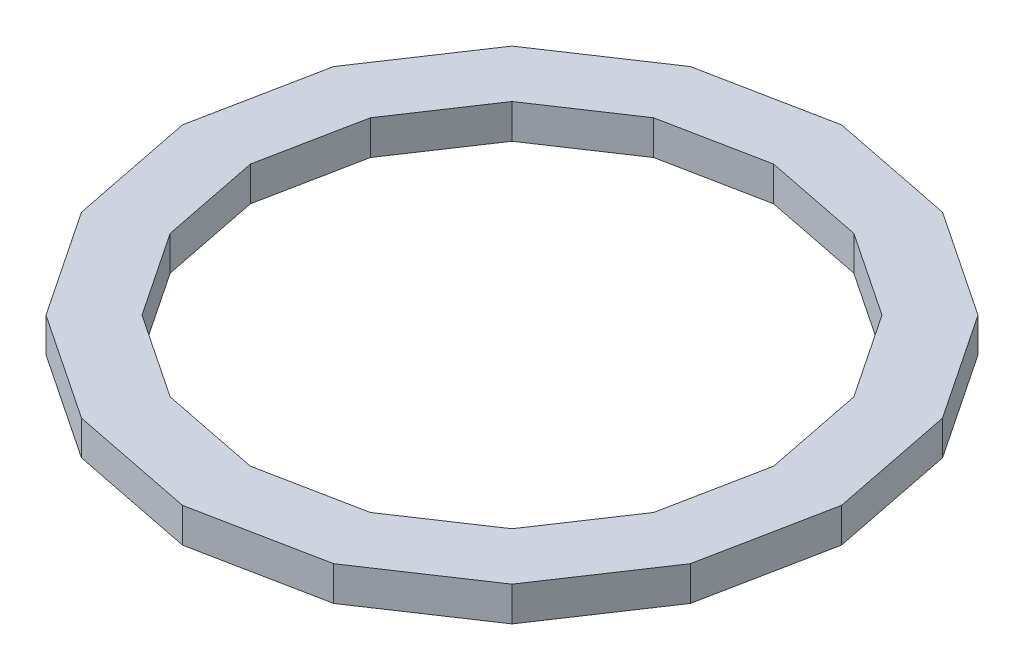
ISO-10303-21;
HEADER;
FILE_DESCRIPTION(('STEP AP214'),'2;1');
FILE_NAME('part.step','',(''),(''),'','','');
FILE_SCHEMA(('AUTOMOTIVE_DESIGN { 1 0 10303 214 1 1 1 1 }'));
ENDSEC;
DATA;
#1=APPLICATION_CONTEXT('core data for automotive mechanical design processes');
#2=APPLICATION_PROTOCOL_DEFINITION('international standard','automotive_design',2000,#1);
#3=PRODUCT_CONTEXT('',#1,'mechanical');
#4=PRODUCT('Part','Part','',(#3));
#5=PRODUCT_RELATED_PRODUCT_CATEGORY('part','',(#4));
#6=PRODUCT_DEFINITION_FORMATION('','',#4);
#7=PRODUCT_DEFINITION_CONTEXT('part definition',#1,'design');
#8=PRODUCT_DEFINITION('design','',#6,#7);
#9=PRODUCT_DEFINITION_SHAPE('','',#8);
#10=(LENGTH_UNIT() NAMED_UNIT(*) SI_UNIT(.MILLI.,.METRE.));
#11=(NAMED_UNIT(*) PLANE_ANGLE_UNIT() SI_UNIT($,.RADIAN.));
#12=(NAMED_UNIT(*) SI_UNIT($,.STERADIAN.) SOLID_ANGLE_UNIT());
#13=UNCERTAINTY_MEASURE_WITH_UNIT(LENGTH_MEASURE(1.E-05),#10,'distance_accuracy_value','');
#14=(GEOMETRIC_REPRESENTATION_CONTEXT(3) GLOBAL_UNCERTAINTY_ASSIGNED_CONTEXT((#13)) GLOBAL_UNIT_ASSIGNED_CONTEXT((#10,
#11,#12)) REPRESENTATION_CONTEXT('',''));
#15=CARTESIAN_POINT('',(0.,0.,0.));
#16=DIRECTION('',(0.,0.,1.));
#17=DIRECTION('',(1.,0.,0.));
#18=AXIS2_PLACEMENT_3D('',#15,#16,#17);
#19=CARTESIAN_POINT('',(0.,19.05,0.));
#20=DIRECTION('',(0.,1.,0.));
#21=DIRECTION('',(0.,0.,1.));
#22=AXIS2_PLACEMENT_3D('',#19,#20,#21);
#23=PLANE('',#22);
#24=DIRECTION('',(0.195090322016117,0.,-0.980785280403233));
#25=VECTOR('',#24,1.);
#26=CARTESIAN_POINT('',(168.399722941589,19.05,69.7534491422757));
#27=LINE('',#26,#25);
#28=CARTESIAN_POINT('',(168.399722941589,19.05,69.7534491422757));
#29=VERTEX_POINT('',#28);
#30=CARTESIAN_POINT('',(182.274546643376,19.05,-2.01228314618185E-12));
#31=VERTEX_POINT('',#30);
#32=EDGE_CURVE('E379',#29,#31,#27,.T.);
#33=ORIENTED_EDGE('',*,*,#32,.T.);
#34=DIRECTION('',(-0.195090322016139,0.,-0.980785280403228));
#35=VECTOR('',#34,1.);
#36=CARTESIAN_POINT('',(182.274546643376,19.05,-2.01228314618185E-12));
#37=LINE('',#36,#35);
#38=CARTESIAN_POINT('',(168.399722941588,19.05,-69.7534491422796));
#39=VERTEX_POINT('',#38);
#40=EDGE_CURVE('E383',#31,#39,#37,.T.);
#41=ORIENTED_EDGE('',*,*,#40,.T.);
#42=DIRECTION('',(-0.555570233019612,0.,-0.831469612302539));
#43=VECTOR('',#42,1.);
#44=CARTESIAN_POINT('',(168.399722941588,19.05,-69.7534491422796));
#45=LINE('',#44,#43);
#46=CARTESIAN_POINT('',(128.887567969233,19.05,-128.887567969236));
#47=VERTEX_POINT('',#46);
#48=EDGE_CURVE('E387',#39,#47,#45,.T.);
#49=ORIENTED_EDGE('',*,*,#48,.T.);
#50=DIRECTION('',(-0.831469612302552,0.,-0.555570233019593));
#51=VECTOR('',#50,1.);
#52=CARTESIAN_POINT('',(128.887567969233,19.05,-128.887567969236));
#53=LINE('',#52,#51);
#54=CARTESIAN_POINT('',(69.7534491422757,19.05,-168.399722941589));
#55=VERTEX_POINT('',#54);
#56=EDGE_CURVE('E389',#47,#55,#53,.T.);
#57=ORIENTED_EDGE('',*,*,#56,.T.);
#58=DIRECTION('',(-0.980785280403233,0.,-0.195090322016117));
#59=VECTOR('',#58,1.);
#60=CARTESIAN_POINT('',(69.7534491422757,19.05,-168.399722941589));
#61=LINE('',#60,#59);
#62=CARTESIAN_POINT('',(-2.12402351105558E-12,19.05,-182.274546643376));
#63=VERTEX_POINT('',#62);
#64=EDGE_CURVE('E392',#55,#63,#61,.T.);
#65=ORIENTED_EDGE('',*,*,#64,.T.);
#66=DIRECTION('',(-0.980785280403228,0.,0.19509032201614));
#67=VECTOR('',#66,1.);
#68=CARTESIAN_POINT('',(-2.12402351105558E-12,19.05,-182.274546643376));
#69=LINE('',#68,#67);
#70=CARTESIAN_POINT('',(-69.7534491422796,19.05,-168.399722941588));
#71=VERTEX_POINT('',#70);
#72=EDGE_CURVE('E394',#63,#71,#69,.T.);
#73=ORIENTED_EDGE('',*,*,#72,.T.);
#74=DIRECTION('',(-0.831469612302539,0.,0.555570233019612));
#75=VECTOR('',#74,1.);
#76=CARTESIAN_POINT('',(-69.7534491422796,19.05,-168.399722941588));
#77=LINE('',#76,#75);
#78=CARTESIAN_POINT('',(-128.887567969236,19.05,-128.887567969233));
#79=VERTEX_POINT('',#78);
#80=EDGE_CURVE('E397',#71,#79,#77,.T.);
#81=ORIENTED_EDGE('',*,*,#80,.T.);
#82=DIRECTION('',(-0.555570233019592,0.,0.831469612302552));
#83=VECTOR('',#82,1.);
#84=CARTESIAN_POINT('',(-128.887567969236,19.05,-128.887567969233));
#85=LINE('',#84,#83);
#86=CARTESIAN_POINT('',(-168.399722941589,19.05,-69.7534491422757));
#87=VERTEX_POINT('',#86);
#88=EDGE_CURVE('E400',#79,#87,#85,.T.);
#89=ORIENTED_EDGE('',*,*,#88,.T.);
#90=DIRECTION('',(-0.195090322016117,0.,0.980785280403233));
#91=VECTOR('',#90,1.);
#92=CARTESIAN_POINT('',(-168.399722941589,19.05,-69.7534491422757));
#93=LINE('',#92,#91);
#94=CARTESIAN_POINT('',(-182.274546643376,19.05,2.02633280482964E-12));
#95=VERTEX_POINT('',#94);
#96=EDGE_CURVE('E403',#87,#95,#93,.T.);
#97=ORIENTED_EDGE('',*,*,#96,.T.);
#98=DIRECTION('',(0.195090322016139,0.,0.980785280403228));
#99=VECTOR('',#98,1.);
#100=CARTESIAN_POINT('',(-182.274546643376,19.05,2.02633280482964E-12));
#101=LINE('',#100,#99);
#102=CARTESIAN_POINT('',(-168.399722941588,19.05,69.7534491422796));
#103=VERTEX_POINT('',#102);
#104=EDGE_CURVE('E406',#95,#103,#101,.T.);
#105=ORIENTED_EDGE('',*,*,#104,.T.);
#106=DIRECTION('',(0.555570233019612,0.,0.831469612302539));
#107=VECTOR('',#106,1.);
#108=CARTESIAN_POINT('',(-168.399722941588,19.05,69.7534491422796));
#109=LINE('',#108,#107);
#110=CARTESIAN_POINT('',(-128.887567969233,19.05,128.887567969236));
#111=VERTEX_POINT('',#110);
#112=EDGE_CURVE('E408',#103,#111,#109,.T.);
#113=ORIENTED_EDGE('',*,*,#112,.T.);
#114=DIRECTION('',(0.831469612302552,0.,0.555570233019593));
#115=VECTOR('',#114,1.);
#116=CARTESIAN_POINT('',(-128.887567969233,19.05,128.887567969236));
#117=LINE('',#116,#115);
#118=CARTESIAN_POINT('',(-69.7534491422758,19.05,168.399722941589));
#119=VERTEX_POINT('',#118);
#120=EDGE_CURVE('E410',#111,#119,#117,.T.);
#121=ORIENTED_EDGE('',*,*,#120,.T.);
#122=DIRECTION('',(0.980785280403233,0.,0.195090322016118));
#123=VECTOR('',#122,1.);
#124=CARTESIAN_POINT('',(-69.7534491422758,19.05,168.399722941589));
#125=LINE('',#124,#123);
#126=CARTESIAN_POINT('',(2.11134736883345E-12,19.05,182.274546643376));
#127=VERTEX_POINT('',#126);
#128=EDGE_CURVE('E412',#119,#127,#125,.T.);
#129=ORIENTED_EDGE('',*,*,#128,.T.);
#130=DIRECTION('',(0.980785280403228,0.,-0.195090322016139));
#131=VECTOR('',#130,1.);
#132=CARTESIAN_POINT('',(2.11134736883345E-12,19.05,182.274546643376));
#133=LINE('',#132,#131);
#134=CARTESIAN_POINT('',(69.7534491422796,19.05,168.399722941588));
#135=VERTEX_POINT('',#134);
#136=EDGE_CURVE('E414',#127,#135,#133,.T.);
#137=ORIENTED_EDGE('',*,*,#136,.T.);
#138=DIRECTION('',(0.831469612302539,0.,-0.555570233019612));
#139=VECTOR('',#138,1.);
#140=CARTESIAN_POINT('',(69.7534491422796,19.05,168.399722941588));
#141=LINE('',#140,#139);
#142=CARTESIAN_POINT('',(128.887567969236,19.05,128.887567969233));
#143=VERTEX_POINT('',#142);
#144=EDGE_CURVE('E416',#135,#143,#141,.T.);
#145=ORIENTED_EDGE('',*,*,#144,.T.);
#146=DIRECTION('',(0.555570233019593,0.,-0.831469612302551));
#147=VECTOR('',#146,1.);
#148=CARTESIAN_POINT('',(128.887567969236,19.05,128.887567969233));
#149=LINE('',#148,#147);
#150=EDGE_CURVE('E419',#143,#29,#149,.T.);
#151=ORIENTED_EDGE('',*,*,#150,.T.);
#152=EDGE_LOOP('',(#33,#41,#49,#57,#65,#73,#81,#89,#97,#105,#113,#121,#129,#137,#145,#151));
#153=FACE_BOUND('',#152,.T.);
#154=DIRECTION('',(-0.195090322016139,0.,-0.980785280403228));
#155=VECTOR('',#154,1.);
#156=CARTESIAN_POINT('',(144.723004286563,19.05,-1.56151390142899E-12));
#157=LINE('',#156,#155);
#158=CARTESIAN_POINT('',(144.723004286563,19.05,-1.56151390142899E-12));
#159=VERTEX_POINT('',#158);
#160=CARTESIAN_POINT('',(133.706621543898,19.05,-55.3830960225711));
#161=VERTEX_POINT('',#160);
#162=EDGE_CURVE('E252',#159,#161,#157,.T.);
#163=ORIENTED_EDGE('',*,*,#162,.F.);
#164=DIRECTION('',(0.195090322016117,0.,-0.980785280403233));
#165=VECTOR('',#164,1.);
#166=CARTESIAN_POINT('',(133.7066215439,19.05,55.3830960225681));
#167=LINE('',#166,#165);
#168=CARTESIAN_POINT('',(133.7066215439,19.05,55.3830960225681));
#169=VERTEX_POINT('',#168);
#170=EDGE_CURVE('E243',#169,#159,#167,.T.);
#171=ORIENTED_EDGE('',*,*,#170,.F.);
#172=DIRECTION('',(0.555570233019593,0.,-0.831469612302552));
#173=VECTOR('',#172,1.);
#174=CARTESIAN_POINT('',(102.33461772472,19.05,102.334617724718));
#175=LINE('',#174,#173);
#176=CARTESIAN_POINT('',(102.33461772472,19.05,102.334617724718));
#177=VERTEX_POINT('',#176);
#178=EDGE_CURVE('E301',#177,#169,#175,.T.);
#179=ORIENTED_EDGE('',*,*,#178,.F.);
#180=DIRECTION('',(0.831469612302539,0.,-0.555570233019612));
#181=VECTOR('',#180,1.);
#182=CARTESIAN_POINT('',(55.3830960225712,19.05,133.706621543898));
#183=LINE('',#182,#181);
#184=CARTESIAN_POINT('',(55.3830960225712,19.05,133.706621543898));
#185=VERTEX_POINT('',#184);
#186=EDGE_CURVE('E299',#185,#177,#183,.T.);
#187=ORIENTED_EDGE('',*,*,#186,.F.);
#188=DIRECTION('',(0.980785280403228,0.,-0.195090322016139));
#189=VECTOR('',#188,1.);
#190=CARTESIAN_POINT('',(1.69946050796369E-12,19.05,144.723004286563));
#191=LINE('',#190,#189);
#192=CARTESIAN_POINT('',(1.69946050796369E-12,19.05,144.723004286563));
#193=VERTEX_POINT('',#192);
#194=EDGE_CURVE('E297',#193,#185,#191,.T.);
#195=ORIENTED_EDGE('',*,*,#194,.F.);
#196=DIRECTION('',(0.980785280403233,0.,0.195090322016117));
#197=VECTOR('',#196,1.);
#198=CARTESIAN_POINT('',(-55.3830960225681,19.05,133.7066215439));
#199=LINE('',#198,#197);
#200=CARTESIAN_POINT('',(-55.3830960225681,19.05,133.7066215439));
#201=VERTEX_POINT('',#200);
#202=EDGE_CURVE('E295',#201,#193,#199,.T.);
#203=ORIENTED_EDGE('',*,*,#202,.F.);
#204=DIRECTION('',(0.831469612302552,0.,0.555570233019593));
#205=VECTOR('',#204,1.);
#206=CARTESIAN_POINT('',(-102.334617724717,19.05,102.33461772472));
#207=LINE('',#206,#205);
#208=CARTESIAN_POINT('',(-102.334617724717,19.05,102.33461772472));
#209=VERTEX_POINT('',#208);
#210=EDGE_CURVE('E293',#209,#201,#207,.T.);
#211=ORIENTED_EDGE('',*,*,#210,.F.);
#212=DIRECTION('',(0.555570233019612,0.,0.831469612302539));
#213=VECTOR('',#212,1.);
#214=CARTESIAN_POINT('',(-133.706621543898,19.05,55.3830960225711));
#215=LINE('',#214,#213);
#216=CARTESIAN_POINT('',(-133.706621543898,19.05,55.3830960225711));
#217=VERTEX_POINT('',#216);
#218=EDGE_CURVE('E291',#217,#209,#215,.T.);
#219=ORIENTED_EDGE('',*,*,#218,.F.);
#220=DIRECTION('',(0.19509032201614,0.,0.980785280403228));
#221=VECTOR('',#220,1.);
#222=CARTESIAN_POINT('',(-144.723004286563,19.05,1.6581214529041E-12));
#223=LINE('',#222,#221);
#224=CARTESIAN_POINT('',(-144.723004286563,19.05,1.6581214529041E-12));
#225=VERTEX_POINT('',#224);
#226=EDGE_CURVE('E289',#225,#217,#223,.T.);
#227=ORIENTED_EDGE('',*,*,#226,.F.);
#228=DIRECTION('',(-0.195090322016117,0.,0.980785280403233));
#229=VECTOR('',#228,1.);
#230=CARTESIAN_POINT('',(-133.7066215439,19.05,-55.383096022568));
#231=LINE('',#230,#229);
#232=CARTESIAN_POINT('',(-133.7066215439,19.05,-55.383096022568));
#233=VERTEX_POINT('',#232);
#234=EDGE_CURVE('E287',#233,#225,#231,.T.);
#235=ORIENTED_EDGE('',*,*,#234,.F.);
#236=DIRECTION('',(-0.555570233019593,0.,0.831469612302552));
#237=VECTOR('',#236,1.);
#238=CARTESIAN_POINT('',(-102.33461772472,19.05,-102.334617724717));
#239=LINE('',#238,#237);
#240=CARTESIAN_POINT('',(-102.33461772472,19.05,-102.334617724717));
#241=VERTEX_POINT('',#240);
#242=EDGE_CURVE('E284',#241,#233,#239,.T.);
#243=ORIENTED_EDGE('',*,*,#242,.F.);
#244=DIRECTION('',(-0.831469612302539,0.,0.555570233019612));
#245=VECTOR('',#244,1.);
#246=CARTESIAN_POINT('',(-55.3830960225711,19.05,-133.706621543898));
#247=LINE('',#246,#245);
#248=CARTESIAN_POINT('',(-55.3830960225711,19.05,-133.706621543898));
#249=VERTEX_POINT('',#248);
#250=EDGE_CURVE('E281',#249,#241,#247,.T.);
#251=ORIENTED_EDGE('',*,*,#250,.F.);
#252=DIRECTION('',(-0.980785280403228,0.,0.195090322016139));
#253=VECTOR('',#252,1.);
#254=CARTESIAN_POINT('',(-1.68620863738242E-12,19.05,-144.723004286563));
#255=LINE('',#254,#253);
#256=CARTESIAN_POINT('',(-1.68620863738242E-12,19.05,-144.723004286563));
#257=VERTEX_POINT('',#256);
#258=EDGE_CURVE('E279',#257,#249,#255,.T.);
#259=ORIENTED_EDGE('',*,*,#258,.F.);
#260=DIRECTION('',(-0.980785280403233,0.,-0.195090322016117));
#261=VECTOR('',#260,1.);
#262=CARTESIAN_POINT('',(55.3830960225681,19.05,-133.7066215439));
#263=LINE('',#262,#261);
#264=CARTESIAN_POINT('',(55.3830960225681,19.05,-133.7066215439));
#265=VERTEX_POINT('',#264);
#266=EDGE_CURVE('E276',#265,#257,#263,.T.);
#267=ORIENTED_EDGE('',*,*,#266,.F.);
#268=DIRECTION('',(-0.831469612302552,0.,-0.555570233019593));
#269=VECTOR('',#268,1.);
#270=CARTESIAN_POINT('',(102.334617724717,19.05,-102.33461772472));
#271=LINE('',#270,#269);
#272=CARTESIAN_POINT('',(102.334617724717,19.05,-102.33461772472));
#273=VERTEX_POINT('',#272);
#274=EDGE_CURVE('E272',#273,#265,#271,.T.);
#275=ORIENTED_EDGE('',*,*,#274,.F.);
#276=DIRECTION('',(-0.555570233019612,0.,-0.831469612302539));
#277=VECTOR('',#276,1.);
#278=CARTESIAN_POINT('',(133.706621543898,19.05,-55.3830960225711));
#279=LINE('',#278,#277);
#280=EDGE_CURVE('E265',#161,#273,#279,.T.);
#281=ORIENTED_EDGE('',*,*,#280,.F.);
#282=EDGE_LOOP('',(#163,#171,#179,#187,#195,#203,#211,#219,#227,#235,#243,#251,#259,#267,#275,#281));
#283=FACE_BOUND('',#282,.T.);
#284=ADVANCED_FACE('F34',(#153,#283),#23,.T.);
#285=CARTESIAN_POINT('',(0.,0.,0.));
#286=DIRECTION('',(0.,1.,0.));
#287=DIRECTION('',(0.,0.,1.));
#288=AXIS2_PLACEMENT_3D('',#285,#286,#287);
#289=PLANE('',#288);
#290=DIRECTION('',(0.195090322016117,0.,-0.980785280403233));
#291=VECTOR('',#290,1.);
#292=CARTESIAN_POINT('',(168.399722941589,0.,69.7534491422757));
#293=LINE('',#292,#291);
#294=CARTESIAN_POINT('',(168.399722941589,0.,69.7534491422757));
#295=VERTEX_POINT('',#294);
#296=CARTESIAN_POINT('',(182.274546643376,0.,-2.01228314618185E-12));
#297=VERTEX_POINT('',#296);
#298=EDGE_CURVE('E260',#295,#297,#293,.T.);
#299=ORIENTED_EDGE('',*,*,#298,.F.);
#300=DIRECTION('',(0.555570233019593,0.,-0.831469612302551));
#301=VECTOR('',#300,1.);
#302=CARTESIAN_POINT('',(128.887567969236,0.,128.887567969233));
#303=LINE('',#302,#301);
#304=CARTESIAN_POINT('',(128.887567969236,0.,128.887567969233));
#305=VERTEX_POINT('',#304);
#306=EDGE_CURVE('E384',#305,#295,#303,.T.);
#307=ORIENTED_EDGE('',*,*,#306,.F.);
#308=DIRECTION('',(0.831469612302539,0.,-0.555570233019612));
#309=VECTOR('',#308,1.);
#310=CARTESIAN_POINT('',(69.7534491422796,0.,168.399722941588));
#311=LINE('',#310,#309);
#312=CARTESIAN_POINT('',(69.7534491422796,0.,168.399722941588));
#313=VERTEX_POINT('',#312);
#314=EDGE_CURVE('E453',#313,#305,#311,.T.);
#315=ORIENTED_EDGE('',*,*,#314,.F.);
#316=DIRECTION('',(0.980785280403228,0.,-0.195090322016139));
#317=VECTOR('',#316,1.);
#318=CARTESIAN_POINT('',(2.11134736883345E-12,0.,182.274546643376));
#319=LINE('',#318,#317);
#320=CARTESIAN_POINT('',(2.11134736883345E-12,0.,182.274546643376));
#321=VERTEX_POINT('',#320);
#322=EDGE_CURVE('E451',#321,#313,#319,.T.);
#323=ORIENTED_EDGE('',*,*,#322,.F.);
#324=DIRECTION('',(0.980785280403233,0.,0.195090322016118));
#325=VECTOR('',#324,1.);
#326=CARTESIAN_POINT('',(-69.7534491422758,0.,168.399722941589));
#327=LINE('',#326,#325);
#328=CARTESIAN_POINT('',(-69.7534491422758,0.,168.399722941589));
#329=VERTEX_POINT('',#328);
#330=EDGE_CURVE('E449',#329,#321,#327,.T.);
#331=ORIENTED_EDGE('',*,*,#330,.F.);
#332=DIRECTION('',(0.831469612302552,0.,0.555570233019593));
#333=VECTOR('',#332,1.);
#334=CARTESIAN_POINT('',(-128.887567969233,0.,128.887567969236));
#335=LINE('',#334,#333);
#336=CARTESIAN_POINT('',(-128.887567969233,0.,128.887567969236));
#337=VERTEX_POINT('',#336);
#338=EDGE_CURVE('E447',#337,#329,#335,.T.);
#339=ORIENTED_EDGE('',*,*,#338,.F.);
#340=DIRECTION('',(0.555570233019612,0.,0.831469612302539));
#341=VECTOR('',#340,1.);
#342=CARTESIAN_POINT('',(-168.399722941588,0.,69.7534491422796));
#343=LINE('',#342,#341);
#344=CARTESIAN_POINT('',(-168.399722941588,0.,69.7534491422796));
#345=VERTEX_POINT('',#344);
#346=EDGE_CURVE('E444',#345,#337,#343,.T.);
#347=ORIENTED_EDGE('',*,*,#346,.F.);
#348=DIRECTION('',(0.195090322016139,0.,0.980785280403228));
#349=VECTOR('',#348,1.);
#350=CARTESIAN_POINT('',(-182.274546643376,0.,2.02633280482964E-12));
#351=LINE('',#350,#349);
#352=CARTESIAN_POINT('',(-182.274546643376,0.,2.02633280482964E-12));
#353=VERTEX_POINT('',#352);
#354=EDGE_CURVE('E442',#353,#345,#351,.T.);
#355=ORIENTED_EDGE('',*,*,#354,.F.);
#356=DIRECTION('',(-0.195090322016117,0.,0.980785280403233));
#357=VECTOR('',#356,1.);
#358=CARTESIAN_POINT('',(-168.399722941589,0.,-69.7534491422757));
#359=LINE('',#358,#357);
#360=CARTESIAN_POINT('',(-168.399722941589,0.,-69.7534491422757));
#361=VERTEX_POINT('',#360);
#362=EDGE_CURVE('E440',#361,#353,#359,.T.);
#363=ORIENTED_EDGE('',*,*,#362,.F.);
#364=DIRECTION('',(-0.555570233019592,0.,0.831469612302552));
#365=VECTOR('',#364,1.);
#366=CARTESIAN_POINT('',(-128.887567969236,0.,-128.887567969233));
#367=LINE('',#366,#365);
#368=CARTESIAN_POINT('',(-128.887567969236,0.,-128.887567969233));
#369=VERTEX_POINT('',#368);
#370=EDGE_CURVE('E437',#369,#361,#367,.T.);
#371=ORIENTED_EDGE('',*,*,#370,.F.);
#372=DIRECTION('',(-0.831469612302539,0.,0.555570233019612));
#373=VECTOR('',#372,1.);
#374=CARTESIAN_POINT('',(-69.7534491422796,0.,-168.399722941588));
#375=LINE('',#374,#373);
#376=CARTESIAN_POINT('',(-69.7534491422796,0.,-168.399722941588));
#377=VERTEX_POINT('',#376);
#378=EDGE_CURVE('E435',#377,#369,#375,.T.);
#379=ORIENTED_EDGE('',*,*,#378,.F.);
#380=DIRECTION('',(-0.980785280403228,0.,0.19509032201614));
#381=VECTOR('',#380,1.);
#382=CARTESIAN_POINT('',(-2.12402351105558E-12,0.,-182.274546643376));
#383=LINE('',#382,#381);
#384=CARTESIAN_POINT('',(-2.12402351105558E-12,0.,-182.274546643376));
#385=VERTEX_POINT('',#384);
#386=EDGE_CURVE('E433',#385,#377,#383,.T.);
#387=ORIENTED_EDGE('',*,*,#386,.F.);
#388=DIRECTION('',(-0.980785280403233,0.,-0.195090322016117));
#389=VECTOR('',#388,1.);
#390=CARTESIAN_POINT('',(69.7534491422757,0.,-168.399722941589));
#391=LINE('',#390,#389);
#392=CARTESIAN_POINT('',(69.7534491422757,0.,-168.399722941589));
#393=VERTEX_POINT('',#392);
#394=EDGE_CURVE('E431',#393,#385,#391,.T.);
#395=ORIENTED_EDGE('',*,*,#394,.F.);
#396=DIRECTION('',(-0.831469612302552,0.,-0.555570233019593));
#397=VECTOR('',#396,1.);
#398=CARTESIAN_POINT('',(128.887567969233,0.,-128.887567969236));
#399=LINE('',#398,#397);
#400=CARTESIAN_POINT('',(128.887567969233,0.,-128.887567969236));
#401=VERTEX_POINT('',#400);
#402=EDGE_CURVE('E429',#401,#393,#399,.T.);
#403=ORIENTED_EDGE('',*,*,#402,.F.);
#404=DIRECTION('',(-0.555570233019612,0.,-0.831469612302539));
#405=VECTOR('',#404,1.);
#406=CARTESIAN_POINT('',(168.399722941588,0.,-69.7534491422796));
#407=LINE('',#406,#405);
#408=CARTESIAN_POINT('',(168.399722941588,0.,-69.7534491422796));
#409=VERTEX_POINT('',#408);
#410=EDGE_CURVE('E426',#409,#401,#407,.T.);
#411=ORIENTED_EDGE('',*,*,#410,.F.);
#412=DIRECTION('',(-0.195090322016139,0.,-0.980785280403228));
#413=VECTOR('',#412,1.);
#414=CARTESIAN_POINT('',(182.274546643376,0.,-2.01228314618185E-12));
#415=LINE('',#414,#413);
#416=EDGE_CURVE('E424',#297,#409,#415,.T.);
#417=ORIENTED_EDGE('',*,*,#416,.F.);
#418=EDGE_LOOP('',(#299,#307,#315,#323,#331,#339,#347,#355,#363,#371,#379,#387,#395,#403,#411,#417));
#419=FACE_BOUND('',#418,.T.);
#420=DIRECTION('',(0.195090322016117,0.,-0.980785280403233));
#421=VECTOR('',#420,1.);
#422=CARTESIAN_POINT('',(133.7066215439,0.,55.3830960225681));
#423=LINE('',#422,#421);
#424=CARTESIAN_POINT('',(133.7066215439,0.,55.3830960225681));
#425=VERTEX_POINT('',#424);
#426=CARTESIAN_POINT('',(144.723004286563,0.,-1.56151390142899E-12));
#427=VERTEX_POINT('',#426);
#428=EDGE_CURVE('E57',#425,#427,#423,.T.);
#429=ORIENTED_EDGE('',*,*,#428,.T.);
#430=DIRECTION('',(-0.195090322016139,0.,-0.980785280403228));
#431=VECTOR('',#430,1.);
#432=CARTESIAN_POINT('',(144.723004286563,0.,-1.56151390142899E-12));
#433=LINE('',#432,#431);
#434=CARTESIAN_POINT('',(133.706621543898,0.,-55.3830960225711));
#435=VERTEX_POINT('',#434);
#436=EDGE_CURVE('E259',#427,#435,#433,.T.);
#437=ORIENTED_EDGE('',*,*,#436,.T.);
#438=DIRECTION('',(-0.555570233019612,0.,-0.831469612302539));
#439=VECTOR('',#438,1.);
#440=CARTESIAN_POINT('',(133.706621543898,0.,-55.3830960225711));
#441=LINE('',#440,#439);
#442=CARTESIAN_POINT('',(102.334617724717,0.,-102.33461772472));
#443=VERTEX_POINT('',#442);
#444=EDGE_CURVE('E307',#435,#443,#441,.T.);
#445=ORIENTED_EDGE('',*,*,#444,.T.);
#446=DIRECTION('',(-0.831469612302552,0.,-0.555570233019593));
#447=VECTOR('',#446,1.);
#448=CARTESIAN_POINT('',(102.334617724717,0.,-102.33461772472));
#449=LINE('',#448,#447);
#450=CARTESIAN_POINT('',(55.3830960225681,0.,-133.7066215439));
#451=VERTEX_POINT('',#450);
#452=EDGE_CURVE('E311',#443,#451,#449,.T.);
#453=ORIENTED_EDGE('',*,*,#452,.T.);
#454=DIRECTION('',(-0.980785280403233,0.,-0.195090322016117));
#455=VECTOR('',#454,1.);
#456=CARTESIAN_POINT('',(55.3830960225681,0.,-133.7066215439));
#457=LINE('',#456,#455);
#458=CARTESIAN_POINT('',(-1.68620863738242E-12,0.,-144.723004286563));
#459=VERTEX_POINT('',#458);
#460=EDGE_CURVE('E314',#451,#459,#457,.T.);
#461=ORIENTED_EDGE('',*,*,#460,.T.);
#462=DIRECTION('',(-0.980785280403228,0.,0.195090322016139));
#463=VECTOR('',#462,1.);
#464=CARTESIAN_POINT('',(-1.68620863738242E-12,0.,-144.723004286563));
#465=LINE('',#464,#463);
#466=CARTESIAN_POINT('',(-55.3830960225711,0.,-133.706621543898));
#467=VERTEX_POINT('',#466);
#468=EDGE_CURVE('E317',#459,#467,#465,.T.);
#469=ORIENTED_EDGE('',*,*,#468,.T.);
#470=DIRECTION('',(-0.831469612302539,0.,0.555570233019612));
#471=VECTOR('',#470,1.);
#472=CARTESIAN_POINT('',(-55.3830960225711,0.,-133.706621543898));
#473=LINE('',#472,#471);
#474=CARTESIAN_POINT('',(-102.33461772472,0.,-102.334617724717));
#475=VERTEX_POINT('',#474);
#476=EDGE_CURVE('E320',#467,#475,#473,.T.);
#477=ORIENTED_EDGE('',*,*,#476,.T.);
#478=DIRECTION('',(-0.555570233019593,0.,0.831469612302552));
#479=VECTOR('',#478,1.);
#480=CARTESIAN_POINT('',(-102.33461772472,0.,-102.334617724717));
#481=LINE('',#480,#479);
#482=CARTESIAN_POINT('',(-133.7066215439,0.,-55.383096022568));
#483=VERTEX_POINT('',#482);
#484=EDGE_CURVE('E323',#475,#483,#481,.T.);
#485=ORIENTED_EDGE('',*,*,#484,.T.);
#486=DIRECTION('',(-0.195090322016117,0.,0.980785280403233));
#487=VECTOR('',#486,1.);
#488=CARTESIAN_POINT('',(-133.7066215439,0.,-55.383096022568));
#489=LINE('',#488,#487);
#490=CARTESIAN_POINT('',(-144.723004286563,0.,1.6581214529041E-12));
#491=VERTEX_POINT('',#490);
#492=EDGE_CURVE('E327',#483,#491,#489,.T.);
#493=ORIENTED_EDGE('',*,*,#492,.T.);
#494=DIRECTION('',(0.19509032201614,0.,0.980785280403228));
#495=VECTOR('',#494,1.);
#496=CARTESIAN_POINT('',(-144.723004286563,0.,1.6581214529041E-12));
#497=LINE('',#496,#495);
#498=CARTESIAN_POINT('',(-133.706621543898,0.,55.3830960225711));
#499=VERTEX_POINT('',#498);
#500=EDGE_CURVE('E330',#491,#499,#497,.T.);
#501=ORIENTED_EDGE('',*,*,#500,.T.);
#502=DIRECTION('',(0.555570233019612,0.,0.831469612302539));
#503=VECTOR('',#502,1.);
#504=CARTESIAN_POINT('',(-133.706621543898,0.,55.3830960225711));
#505=LINE('',#504,#503);
#506=CARTESIAN_POINT('',(-102.334617724717,0.,102.33461772472));
#507=VERTEX_POINT('',#506);
#508=EDGE_CURVE('E333',#499,#507,#505,.T.);
#509=ORIENTED_EDGE('',*,*,#508,.T.);
#510=DIRECTION('',(0.831469612302552,0.,0.555570233019593));
#511=VECTOR('',#510,1.);
#512=CARTESIAN_POINT('',(-102.334617724717,0.,102.33461772472));
#513=LINE('',#512,#511);
#514=CARTESIAN_POINT('',(-55.3830960225681,0.,133.7066215439));
#515=VERTEX_POINT('',#514);
#516=EDGE_CURVE('E336',#507,#515,#513,.T.);
#517=ORIENTED_EDGE('',*,*,#516,.T.);
#518=DIRECTION('',(0.980785280403233,0.,0.195090322016117));
#519=VECTOR('',#518,1.);
#520=CARTESIAN_POINT('',(-55.3830960225681,0.,133.7066215439));
#521=LINE('',#520,#519);
#522=CARTESIAN_POINT('',(1.69946050796369E-12,0.,144.723004286563));
#523=VERTEX_POINT('',#522);
#524=EDGE_CURVE('E339',#515,#523,#521,.T.);
#525=ORIENTED_EDGE('',*,*,#524,.T.);
#526=DIRECTION('',(0.980785280403228,0.,-0.195090322016139));
#527=VECTOR('',#526,1.);
#528=CARTESIAN_POINT('',(1.69946050796369E-12,0.,144.723004286563));
#529=LINE('',#528,#527);
#530=CARTESIAN_POINT('',(55.3830960225712,0.,133.706621543898));
#531=VERTEX_POINT('',#530);
#532=EDGE_CURVE('E342',#523,#531,#529,.T.);
#533=ORIENTED_EDGE('',*,*,#532,.T.);
#534=DIRECTION('',(0.831469612302539,0.,-0.555570233019612));
#535=VECTOR('',#534,1.);
#536=CARTESIAN_POINT('',(55.3830960225712,0.,133.706621543898));
#537=LINE('',#536,#535);
#538=CARTESIAN_POINT('',(102.33461772472,0.,102.334617724718));
#539=VERTEX_POINT('',#538);
#540=EDGE_CURVE('E345',#531,#539,#537,.T.);
#541=ORIENTED_EDGE('',*,*,#540,.T.);
#542=DIRECTION('',(0.555570233019593,0.,-0.831469612302552));
#543=VECTOR('',#542,1.);
#544=CARTESIAN_POINT('',(102.33461772472,0.,102.334617724718));
#545=LINE('',#544,#543);
#546=EDGE_CURVE('E253',#539,#425,#545,.T.);
#547=ORIENTED_EDGE('',*,*,#546,.T.);
#548=EDGE_LOOP('',(#429,#437,#445,#453,#461,#469,#477,#485,#493,#501,#509,#517,#525,#533,#541,#547));
#549=FACE_BOUND('',#548,.T.);
#550=ADVANCED_FACE('F511',(#419,#549),#289,.F.);
#551=CARTESIAN_POINT('',(168.399722941589,19.05,69.7534491422757));
#552=DIRECTION('',(-0.980785280403233,0.,-0.195090322016117));
#553=DIRECTION('',(-0.195090322016117,0.,0.980785280403233));
#554=AXIS2_PLACEMENT_3D('',#551,#552,#553);
#555=PLANE('',#554);
#556=ORIENTED_EDGE('',*,*,#298,.T.);
#557=DIRECTION('',(0.,-1.,0.));
#558=VECTOR('',#557,1.);
#559=CARTESIAN_POINT('',(182.274546643376,19.05,-2.01228314618185E-12));
#560=LINE('',#559,#558);
#561=EDGE_CURVE('E11',#31,#297,#560,.T.);
#562=ORIENTED_EDGE('',*,*,#561,.F.);
#563=ORIENTED_EDGE('',*,*,#32,.F.);
#564=DIRECTION('',(0.,-1.,0.));
#565=VECTOR('',#564,1.);
#566=CARTESIAN_POINT('',(168.399722941589,19.05,69.7534491422757));
#567=LINE('',#566,#565);
#568=EDGE_CURVE('E421',#29,#295,#567,.T.);
#569=ORIENTED_EDGE('',*,*,#568,.T.);
#570=EDGE_LOOP('',(#556,#562,#563,#569));
#571=FACE_BOUND('',#570,.T.);
#572=ADVANCED_FACE('F36',(#571),#555,.F.);
#573=CARTESIAN_POINT('',(182.274546643376,19.05,-2.01228314618185E-12));
#574=DIRECTION('',(-0.980785280403228,0.,0.195090322016139));
#575=DIRECTION('',(0.195090322016139,0.,0.980785280403228));
#576=AXIS2_PLACEMENT_3D('',#573,#574,#575);
#577=PLANE('',#576);
#578=ORIENTED_EDGE('',*,*,#416,.T.);
#579=DIRECTION('',(0.,-1.,0.));
#580=VECTOR('',#579,1.);
#581=CARTESIAN_POINT('',(168.399722941588,19.05,-69.7534491422796));
#582=LINE('',#581,#580);
#583=EDGE_CURVE('E42',#39,#409,#582,.T.);
#584=ORIENTED_EDGE('',*,*,#583,.F.);
#585=ORIENTED_EDGE('',*,*,#40,.F.);
#586=ORIENTED_EDGE('',*,*,#561,.T.);
#587=EDGE_LOOP('',(#578,#584,#585,#586));
#588=FACE_BOUND('',#587,.T.);
#589=ADVANCED_FACE('F528',(#588),#577,.F.);
#590=CARTESIAN_POINT('',(168.399722941588,19.05,-69.7534491422796));
#591=DIRECTION('',(-0.831469612302539,0.,0.555570233019612));
#592=DIRECTION('',(0.555570233019612,0.,0.831469612302539));
#593=AXIS2_PLACEMENT_3D('',#590,#591,#592);
#594=PLANE('',#593);
#595=ORIENTED_EDGE('',*,*,#410,.T.);
#596=DIRECTION('',(0.,-1.,0.));
#597=VECTOR('',#596,1.);
#598=CARTESIAN_POINT('',(128.887567969233,19.05,-128.887567969236));
#599=LINE('',#598,#597);
#600=EDGE_CURVE('E498',#47,#401,#599,.T.);
#601=ORIENTED_EDGE('',*,*,#600,.F.);
#602=ORIENTED_EDGE('',*,*,#48,.F.);
#603=ORIENTED_EDGE('',*,*,#583,.T.);
#604=EDGE_LOOP('',(#595,#601,#602,#603));
#605=FACE_BOUND('',#604,.T.);
#606=ADVANCED_FACE('F505',(#605),#594,.F.);
#607=CARTESIAN_POINT('',(128.887567969233,19.05,-128.887567969236));
#608=DIRECTION('',(-0.555570233019592,0.,0.831469612302552));
#609=DIRECTION('',(0.831469612302552,0.,0.555570233019593));
#610=AXIS2_PLACEMENT_3D('',#607,#608,#609);
#611=PLANE('',#610);
#612=ORIENTED_EDGE('',*,*,#402,.T.);
#613=DIRECTION('',(0.,-1.,0.));
#614=VECTOR('',#613,1.);
#615=CARTESIAN_POINT('',(69.7534491422757,19.05,-168.399722941589));
#616=LINE('',#615,#614);
#617=EDGE_CURVE('E495',#55,#393,#616,.T.);
#618=ORIENTED_EDGE('',*,*,#617,.F.);
#619=ORIENTED_EDGE('',*,*,#56,.F.);
#620=ORIENTED_EDGE('',*,*,#600,.T.);
#621=EDGE_LOOP('',(#612,#618,#619,#620));
#622=FACE_BOUND('',#621,.T.);
#623=ADVANCED_FACE('F517',(#622),#611,.F.);
#624=CARTESIAN_POINT('',(69.7534491422757,19.05,-168.399722941589));
#625=DIRECTION('',(-0.195090322016117,0.,0.980785280403233));
#626=DIRECTION('',(0.980785280403233,0.,0.195090322016117));
#627=AXIS2_PLACEMENT_3D('',#624,#625,#626);
#628=PLANE('',#627);
#629=ORIENTED_EDGE('',*,*,#394,.T.);
#630=DIRECTION('',(0.,-1.,0.));
#631=VECTOR('',#630,1.);
#632=CARTESIAN_POINT('',(-2.12402351105558E-12,19.05,-182.274546643376));
#633=LINE('',#632,#631);
#634=EDGE_CURVE('E491',#63,#385,#633,.T.);
#635=ORIENTED_EDGE('',*,*,#634,.F.);
#636=ORIENTED_EDGE('',*,*,#64,.F.);
#637=ORIENTED_EDGE('',*,*,#617,.T.);
#638=EDGE_LOOP('',(#629,#635,#636,#637));
#639=FACE_BOUND('',#638,.T.);
#640=ADVANCED_FACE('F521',(#639),#628,.F.);
#641=CARTESIAN_POINT('',(-2.12402351105558E-12,19.05,-182.274546643376));
#642=DIRECTION('',(0.19509032201614,0.,0.980785280403228));
#643=DIRECTION('',(0.980785280403228,0.,-0.19509032201614));
#644=AXIS2_PLACEMENT_3D('',#641,#642,#643);
#645=PLANE('',#644);
#646=ORIENTED_EDGE('',*,*,#386,.T.);
#647=DIRECTION('',(0.,-1.,0.));
#648=VECTOR('',#647,1.);
#649=CARTESIAN_POINT('',(-69.7534491422796,19.05,-168.399722941588));
#650=LINE('',#649,#648);
#651=EDGE_CURVE('E487',#71,#377,#650,.T.);
#652=ORIENTED_EDGE('',*,*,#651,.F.);
#653=ORIENTED_EDGE('',*,*,#72,.F.);
#654=ORIENTED_EDGE('',*,*,#634,.T.);
#655=EDGE_LOOP('',(#646,#652,#653,#654));
#656=FACE_BOUND('',#655,.T.);
#657=ADVANCED_FACE('F581',(#656),#645,.F.);
#658=CARTESIAN_POINT('',(-69.7534491422796,19.05,-168.399722941588));
#659=DIRECTION('',(0.555570233019612,0.,0.831469612302539));
#660=DIRECTION('',(0.831469612302539,0.,-0.555570233019612));
#661=AXIS2_PLACEMENT_3D('',#658,#659,#660);
#662=PLANE('',#661);
#663=ORIENTED_EDGE('',*,*,#378,.T.);
#664=DIRECTION('',(0.,-1.,0.));
#665=VECTOR('',#664,1.);
#666=CARTESIAN_POINT('',(-128.887567969236,19.05,-128.887567969233));
#667=LINE('',#666,#665);
#668=EDGE_CURVE('E484',#79,#369,#667,.T.);
#669=ORIENTED_EDGE('',*,*,#668,.F.);
#670=ORIENTED_EDGE('',*,*,#80,.F.);
#671=ORIENTED_EDGE('',*,*,#651,.T.);
#672=EDGE_LOOP('',(#663,#669,#670,#671));
#673=FACE_BOUND('',#672,.T.);
#674=ADVANCED_FACE('F578',(#673),#662,.F.);
#675=CARTESIAN_POINT('',(-128.887567969236,19.05,-128.887567969233));
#676=DIRECTION('',(0.831469612302552,0.,0.555570233019592));
#677=DIRECTION('',(0.555570233019592,0.,-0.831469612302552));
#678=AXIS2_PLACEMENT_3D('',#675,#676,#677);
#679=PLANE('',#678);
#680=ORIENTED_EDGE('',*,*,#370,.T.);
#681=DIRECTION('',(0.,-1.,0.));
#682=VECTOR('',#681,1.);
#683=CARTESIAN_POINT('',(-168.399722941589,19.05,-69.7534491422757));
#684=LINE('',#683,#682);
#685=EDGE_CURVE('E480',#87,#361,#684,.T.);
#686=ORIENTED_EDGE('',*,*,#685,.F.);
#687=ORIENTED_EDGE('',*,*,#88,.F.);
#688=ORIENTED_EDGE('',*,*,#668,.T.);
#689=EDGE_LOOP('',(#680,#686,#687,#688));
#690=FACE_BOUND('',#689,.T.);
#691=ADVANCED_FACE('F574',(#690),#679,.F.);
#692=CARTESIAN_POINT('',(-168.399722941589,19.05,-69.7534491422757));
#693=DIRECTION('',(0.980785280403233,0.,0.195090322016117));
#694=DIRECTION('',(0.195090322016117,0.,-0.980785280403233));
#695=AXIS2_PLACEMENT_3D('',#692,#693,#694);
#696=PLANE('',#695);
#697=ORIENTED_EDGE('',*,*,#362,.T.);
#698=DIRECTION('',(0.,-1.,0.));
#699=VECTOR('',#698,1.);
#700=CARTESIAN_POINT('',(-182.274546643376,19.05,2.02633280482964E-12));
#701=LINE('',#700,#699);
#702=EDGE_CURVE('E477',#95,#353,#701,.T.);
#703=ORIENTED_EDGE('',*,*,#702,.F.);
#704=ORIENTED_EDGE('',*,*,#96,.F.);
#705=ORIENTED_EDGE('',*,*,#685,.T.);
#706=EDGE_LOOP('',(#697,#703,#704,#705));
#707=FACE_BOUND('',#706,.T.);
#708=ADVANCED_FACE('F570',(#707),#696,.F.);
#709=CARTESIAN_POINT('',(-182.274546643376,19.05,2.02633280482964E-12));
#710=DIRECTION('',(0.980785280403228,0.,-0.195090322016139));
#711=DIRECTION('',(-0.195090322016139,0.,-0.980785280403228));
#712=AXIS2_PLACEMENT_3D('',#709,#710,#711);
#713=PLANE('',#712);
#714=ORIENTED_EDGE('',*,*,#354,.T.);
#715=DIRECTION('',(0.,-1.,0.));
#716=VECTOR('',#715,1.);
#717=CARTESIAN_POINT('',(-168.399722941588,19.05,69.7534491422796));
#718=LINE('',#717,#716);
#719=EDGE_CURVE('E474',#103,#345,#718,.T.);
#720=ORIENTED_EDGE('',*,*,#719,.F.);
#721=ORIENTED_EDGE('',*,*,#104,.F.);
#722=ORIENTED_EDGE('',*,*,#702,.T.);
#723=EDGE_LOOP('',(#714,#720,#721,#722));
#724=FACE_BOUND('',#723,.T.);
#725=ADVANCED_FACE('F565',(#724),#713,.F.);
#726=CARTESIAN_POINT('',(-168.399722941588,19.05,69.7534491422796));
#727=DIRECTION('',(0.831469612302539,0.,-0.555570233019612));
#728=DIRECTION('',(-0.555570233019612,0.,-0.831469612302539));
#729=AXIS2_PLACEMENT_3D('',#726,#727,#728);
#730=PLANE('',#729);
#731=ORIENTED_EDGE('',*,*,#346,.T.);
#732=DIRECTION('',(0.,-1.,0.));
#733=VECTOR('',#732,1.);
#734=CARTESIAN_POINT('',(-128.887567969233,19.05,128.887567969236));
#735=LINE('',#734,#733);
#736=EDGE_CURVE('E471',#111,#337,#735,.T.);
#737=ORIENTED_EDGE('',*,*,#736,.F.);
#738=ORIENTED_EDGE('',*,*,#112,.F.);
#739=ORIENTED_EDGE('',*,*,#719,.T.);
#740=EDGE_LOOP('',(#731,#737,#738,#739));
#741=FACE_BOUND('',#740,.T.);
#742=ADVANCED_FACE('F559',(#741),#730,.F.);
#743=CARTESIAN_POINT('',(-128.887567969233,19.05,128.887567969236));
#744=DIRECTION('',(0.555570233019593,0.,-0.831469612302552));
#745=DIRECTION('',(-0.831469612302552,0.,-0.555570233019593));
#746=AXIS2_PLACEMENT_3D('',#743,#744,#745);
#747=PLANE('',#746);
#748=ORIENTED_EDGE('',*,*,#338,.T.);
#749=DIRECTION('',(0.,-1.,0.));
#750=VECTOR('',#749,1.);
#751=CARTESIAN_POINT('',(-69.7534491422758,19.05,168.399722941589));
#752=LINE('',#751,#750);
#753=EDGE_CURVE('E468',#119,#329,#752,.T.);
#754=ORIENTED_EDGE('',*,*,#753,.F.);
#755=ORIENTED_EDGE('',*,*,#120,.F.);
#756=ORIENTED_EDGE('',*,*,#736,.T.);
#757=EDGE_LOOP('',(#748,#754,#755,#756));
#758=FACE_BOUND('',#757,.T.);
#759=ADVANCED_FACE('F555',(#758),#747,.F.);
#760=CARTESIAN_POINT('',(-69.7534491422758,19.05,168.399722941589));
#761=DIRECTION('',(0.195090322016118,0.,-0.980785280403233));
#762=DIRECTION('',(-0.980785280403233,0.,-0.195090322016118));
#763=AXIS2_PLACEMENT_3D('',#760,#761,#762);
#764=PLANE('',#763);
#765=ORIENTED_EDGE('',*,*,#330,.T.);
#766=DIRECTION('',(0.,-1.,0.));
#767=VECTOR('',#766,1.);
#768=CARTESIAN_POINT('',(2.11134736883345E-12,19.05,182.274546643376));
#769=LINE('',#768,#767);
#770=EDGE_CURVE('E465',#127,#321,#769,.T.);
#771=ORIENTED_EDGE('',*,*,#770,.F.);
#772=ORIENTED_EDGE('',*,*,#128,.F.);
#773=ORIENTED_EDGE('',*,*,#753,.T.);
#774=EDGE_LOOP('',(#765,#771,#772,#773));
#775=FACE_BOUND('',#774,.T.);
#776=ADVANCED_FACE('F550',(#775),#764,.F.);
#777=CARTESIAN_POINT('',(2.11134736883345E-12,19.05,182.274546643376));
#778=DIRECTION('',(-0.195090322016139,0.,-0.980785280403228));
#779=DIRECTION('',(-0.980785280403228,0.,0.195090322016139));
#780=AXIS2_PLACEMENT_3D('',#777,#778,#779);
#781=PLANE('',#780);
#782=ORIENTED_EDGE('',*,*,#322,.T.);
#783=DIRECTION('',(0.,-1.,0.));
#784=VECTOR('',#783,1.);
#785=CARTESIAN_POINT('',(69.7534491422796,19.05,168.399722941588));
#786=LINE('',#785,#784);
#787=EDGE_CURVE('E462',#135,#313,#786,.T.);
#788=ORIENTED_EDGE('',*,*,#787,.F.);
#789=ORIENTED_EDGE('',*,*,#136,.F.);
#790=ORIENTED_EDGE('',*,*,#770,.T.);
#791=EDGE_LOOP('',(#782,#788,#789,#790));
#792=FACE_BOUND('',#791,.T.);
#793=ADVANCED_FACE('F544',(#792),#781,.F.);
#794=CARTESIAN_POINT('',(69.7534491422796,19.05,168.399722941588));
#795=DIRECTION('',(-0.555570233019612,0.,-0.831469612302539));
#796=DIRECTION('',(-0.831469612302539,0.,0.555570233019612));
#797=AXIS2_PLACEMENT_3D('',#794,#795,#796);
#798=PLANE('',#797);
#799=ORIENTED_EDGE('',*,*,#314,.T.);
#800=DIRECTION('',(0.,-1.,0.));
#801=VECTOR('',#800,1.);
#802=CARTESIAN_POINT('',(128.887567969236,19.05,128.887567969233));
#803=LINE('',#802,#801);
#804=EDGE_CURVE('E459',#143,#305,#803,.T.);
#805=ORIENTED_EDGE('',*,*,#804,.F.);
#806=ORIENTED_EDGE('',*,*,#144,.F.);
#807=ORIENTED_EDGE('',*,*,#787,.T.);
#808=EDGE_LOOP('',(#799,#805,#806,#807));
#809=FACE_BOUND('',#808,.T.);
#810=ADVANCED_FACE('F540',(#809),#798,.F.);
#811=CARTESIAN_POINT('',(128.887567969236,19.05,128.887567969233));
#812=DIRECTION('',(-0.831469612302551,0.,-0.555570233019593));
#813=DIRECTION('',(-0.555570233019593,0.,0.831469612302551));
#814=AXIS2_PLACEMENT_3D('',#811,#812,#813);
#815=PLANE('',#814);
#816=ORIENTED_EDGE('',*,*,#306,.T.);
#817=ORIENTED_EDGE('',*,*,#568,.F.);
#818=ORIENTED_EDGE('',*,*,#150,.F.);
#819=ORIENTED_EDGE('',*,*,#804,.T.);
#820=EDGE_LOOP('',(#816,#817,#818,#819));
#821=FACE_BOUND('',#820,.T.);
#822=ADVANCED_FACE('F535',(#821),#815,.F.);
#823=CARTESIAN_POINT('',(133.7066215439,19.05,55.3830960225681));
#824=DIRECTION('',(-0.980785280403233,0.,-0.195090322016117));
#825=DIRECTION('',(-0.195090322016117,0.,0.980785280403233));
#826=AXIS2_PLACEMENT_3D('',#823,#824,#825);
#827=PLANE('',#826);
#828=ORIENTED_EDGE('',*,*,#428,.F.);
#829=DIRECTION('',(0.,-1.,0.));
#830=VECTOR('',#829,1.);
#831=CARTESIAN_POINT('',(133.7066215439,19.05,55.3830960225681));
#832=LINE('',#831,#830);
#833=EDGE_CURVE('E247',#169,#425,#832,.T.);
#834=ORIENTED_EDGE('',*,*,#833,.F.);
#835=ORIENTED_EDGE('',*,*,#170,.T.);
#836=DIRECTION('',(0.,-1.,0.));
#837=VECTOR('',#836,1.);
#838=CARTESIAN_POINT('',(144.723004286563,19.05,-1.56151390142899E-12));
#839=LINE('',#838,#837);
#840=EDGE_CURVE('E246',#159,#427,#839,.T.);
#841=ORIENTED_EDGE('',*,*,#840,.T.);
#842=EDGE_LOOP('',(#828,#834,#835,#841));
#843=FACE_BOUND('',#842,.T.);
#844=ADVANCED_FACE('F245',(#843),#827,.T.);
#845=CARTESIAN_POINT('',(144.723004286563,19.05,-1.56151390142899E-12));
#846=DIRECTION('',(-0.980785280403228,0.,0.195090322016139));
#847=DIRECTION('',(0.195090322016139,0.,0.980785280403228));
#848=AXIS2_PLACEMENT_3D('',#845,#846,#847);
#849=PLANE('',#848);
#850=ORIENTED_EDGE('',*,*,#436,.F.);
#851=ORIENTED_EDGE('',*,*,#840,.F.);
#852=ORIENTED_EDGE('',*,*,#162,.T.);
#853=DIRECTION('',(0.,-1.,0.));
#854=VECTOR('',#853,1.);
#855=CARTESIAN_POINT('',(133.706621543898,19.05,-55.3830960225711));
#856=LINE('',#855,#854);
#857=EDGE_CURVE('E261',#161,#435,#856,.T.);
#858=ORIENTED_EDGE('',*,*,#857,.T.);
#859=EDGE_LOOP('',(#850,#851,#852,#858));
#860=FACE_BOUND('',#859,.T.);
#861=ADVANCED_FACE('F256',(#860),#849,.T.);
#862=CARTESIAN_POINT('',(133.706621543898,19.05,-55.3830960225711));
#863=DIRECTION('',(-0.831469612302539,0.,0.555570233019612));
#864=DIRECTION('',(0.555570233019612,0.,0.831469612302539));
#865=AXIS2_PLACEMENT_3D('',#862,#863,#864);
#866=PLANE('',#865);
#867=ORIENTED_EDGE('',*,*,#444,.F.);
#868=ORIENTED_EDGE('',*,*,#857,.F.);
#869=ORIENTED_EDGE('',*,*,#280,.T.);
#870=DIRECTION('',(0.,-1.,0.));
#871=VECTOR('',#870,1.);
#872=CARTESIAN_POINT('',(102.334617724717,19.05,-102.33461772472));
#873=LINE('',#872,#871);
#874=EDGE_CURVE('E374',#273,#443,#873,.T.);
#875=ORIENTED_EDGE('',*,*,#874,.T.);
#876=EDGE_LOOP('',(#867,#868,#869,#875));
#877=FACE_BOUND('',#876,.T.);
#878=ADVANCED_FACE('F663',(#877),#866,.T.);
#879=CARTESIAN_POINT('',(102.334617724717,19.05,-102.33461772472));
#880=DIRECTION('',(-0.555570233019592,0.,0.831469612302552));
#881=DIRECTION('',(0.831469612302552,0.,0.555570233019593));
#882=AXIS2_PLACEMENT_3D('',#879,#880,#881);
#883=PLANE('',#882);
#884=ORIENTED_EDGE('',*,*,#452,.F.);
#885=ORIENTED_EDGE('',*,*,#874,.F.);
#886=ORIENTED_EDGE('',*,*,#274,.T.);
#887=DIRECTION('',(0.,-1.,0.));
#888=VECTOR('',#887,1.);
#889=CARTESIAN_POINT('',(55.3830960225681,19.05,-133.7066215439));
#890=LINE('',#889,#888);
#891=EDGE_CURVE('E372',#265,#451,#890,.T.);
#892=ORIENTED_EDGE('',*,*,#891,.T.);
#893=EDGE_LOOP('',(#884,#885,#886,#892));
#894=FACE_BOUND('',#893,.T.);
#895=ADVANCED_FACE('F669',(#894),#883,.T.);
#896=CARTESIAN_POINT('',(55.3830960225681,19.05,-133.7066215439));
#897=DIRECTION('',(-0.195090322016117,0.,0.980785280403233));
#898=DIRECTION('',(0.980785280403233,0.,0.195090322016117));
#899=AXIS2_PLACEMENT_3D('',#896,#897,#898);
#900=PLANE('',#899);
#901=ORIENTED_EDGE('',*,*,#460,.F.);
#902=ORIENTED_EDGE('',*,*,#891,.F.);
#903=ORIENTED_EDGE('',*,*,#266,.T.);
#904=DIRECTION('',(0.,-1.,0.));
#905=VECTOR('',#904,1.);
#906=CARTESIAN_POINT('',(-1.68620863738242E-12,19.05,-144.723004286563));
#907=LINE('',#906,#905);
#908=EDGE_CURVE('E370',#257,#459,#907,.T.);
#909=ORIENTED_EDGE('',*,*,#908,.T.);
#910=EDGE_LOOP('',(#901,#902,#903,#909));
#911=FACE_BOUND('',#910,.T.);
#912=ADVANCED_FACE('F677',(#911),#900,.T.);
#913=CARTESIAN_POINT('',(-1.68620863738242E-12,19.05,-144.723004286563));
#914=DIRECTION('',(0.195090322016139,0.,0.980785280403228));
#915=DIRECTION('',(0.980785280403228,0.,-0.195090322016139));
#916=AXIS2_PLACEMENT_3D('',#913,#914,#915);
#917=PLANE('',#916);
#918=ORIENTED_EDGE('',*,*,#468,.F.);
#919=ORIENTED_EDGE('',*,*,#908,.F.);
#920=ORIENTED_EDGE('',*,*,#258,.T.);
#921=DIRECTION('',(0.,-1.,0.));
#922=VECTOR('',#921,1.);
#923=CARTESIAN_POINT('',(-55.3830960225711,19.05,-133.706621543898));
#924=LINE('',#923,#922);
#925=EDGE_CURVE('E368',#249,#467,#924,.T.);
#926=ORIENTED_EDGE('',*,*,#925,.T.);
#927=EDGE_LOOP('',(#918,#919,#920,#926));
#928=FACE_BOUND('',#927,.T.);
#929=ADVANCED_FACE('F685',(#928),#917,.T.);
#930=CARTESIAN_POINT('',(-55.3830960225711,19.05,-133.706621543898));
#931=DIRECTION('',(0.555570233019612,0.,0.831469612302539));
#932=DIRECTION('',(0.831469612302539,0.,-0.555570233019612));
#933=AXIS2_PLACEMENT_3D('',#930,#931,#932);
#934=PLANE('',#933);
#935=ORIENTED_EDGE('',*,*,#476,.F.);
#936=ORIENTED_EDGE('',*,*,#925,.F.);
#937=ORIENTED_EDGE('',*,*,#250,.T.);
#938=DIRECTION('',(0.,-1.,0.));
#939=VECTOR('',#938,1.);
#940=CARTESIAN_POINT('',(-102.33461772472,19.05,-102.334617724717));
#941=LINE('',#940,#939);
#942=EDGE_CURVE('E366',#241,#475,#941,.T.);
#943=ORIENTED_EDGE('',*,*,#942,.T.);
#944=EDGE_LOOP('',(#935,#936,#937,#943));
#945=FACE_BOUND('',#944,.T.);
#946=ADVANCED_FACE('F693',(#945),#934,.T.);
#947=CARTESIAN_POINT('',(-102.33461772472,19.05,-102.334617724717));
#948=DIRECTION('',(0.831469612302551,0.,0.555570233019593));
#949=DIRECTION('',(0.555570233019593,0.,-0.831469612302552));
#950=AXIS2_PLACEMENT_3D('',#947,#948,#949);
#951=PLANE('',#950);
#952=ORIENTED_EDGE('',*,*,#484,.F.);
#953=ORIENTED_EDGE('',*,*,#942,.F.);
#954=ORIENTED_EDGE('',*,*,#242,.T.);
#955=DIRECTION('',(0.,-1.,0.));
#956=VECTOR('',#955,1.);
#957=CARTESIAN_POINT('',(-133.7066215439,19.05,-55.383096022568));
#958=LINE('',#957,#956);
#959=EDGE_CURVE('E364',#233,#483,#958,.T.);
#960=ORIENTED_EDGE('',*,*,#959,.T.);
#961=EDGE_LOOP('',(#952,#953,#954,#960));
#962=FACE_BOUND('',#961,.T.);
#963=ADVANCED_FACE('F701',(#962),#951,.T.);
#964=CARTESIAN_POINT('',(-133.7066215439,19.05,-55.383096022568));
#965=DIRECTION('',(0.980785280403233,0.,0.195090322016117));
#966=DIRECTION('',(0.195090322016117,0.,-0.980785280403233));
#967=AXIS2_PLACEMENT_3D('',#964,#965,#966);
#968=PLANE('',#967);
#969=ORIENTED_EDGE('',*,*,#492,.F.);
#970=ORIENTED_EDGE('',*,*,#959,.F.);
#971=ORIENTED_EDGE('',*,*,#234,.T.);
#972=DIRECTION('',(0.,-1.,0.));
#973=VECTOR('',#972,1.);
#974=CARTESIAN_POINT('',(-144.723004286563,19.05,1.6581214529041E-12));
#975=LINE('',#974,#973);
#976=EDGE_CURVE('E362',#225,#491,#975,.T.);
#977=ORIENTED_EDGE('',*,*,#976,.T.);
#978=EDGE_LOOP('',(#969,#970,#971,#977));
#979=FACE_BOUND('',#978,.T.);
#980=ADVANCED_FACE('F709',(#979),#968,.T.);
#981=CARTESIAN_POINT('',(-144.723004286563,19.05,1.6581214529041E-12));
#982=DIRECTION('',(0.980785280403228,0.,-0.19509032201614));
#983=DIRECTION('',(-0.19509032201614,0.,-0.980785280403228));
#984=AXIS2_PLACEMENT_3D('',#981,#982,#983);
#985=PLANE('',#984);
#986=ORIENTED_EDGE('',*,*,#500,.F.);
#987=ORIENTED_EDGE('',*,*,#976,.F.);
#988=ORIENTED_EDGE('',*,*,#226,.T.);
#989=DIRECTION('',(0.,-1.,0.));
#990=VECTOR('',#989,1.);
#991=CARTESIAN_POINT('',(-133.706621543898,19.05,55.3830960225711));
#992=LINE('',#991,#990);
#993=EDGE_CURVE('E360',#217,#499,#992,.T.);
#994=ORIENTED_EDGE('',*,*,#993,.T.);
#995=EDGE_LOOP('',(#986,#987,#988,#994));
#996=FACE_BOUND('',#995,.T.);
#997=ADVANCED_FACE('F717',(#996),#985,.T.);
#998=CARTESIAN_POINT('',(-133.706621543898,19.05,55.3830960225711));
#999=DIRECTION('',(0.831469612302539,0.,-0.555570233019612));
#1000=DIRECTION('',(-0.555570233019612,0.,-0.831469612302539));
#1001=AXIS2_PLACEMENT_3D('',#998,#999,#1000);
#1002=PLANE('',#1001);
#1003=ORIENTED_EDGE('',*,*,#508,.F.);
#1004=ORIENTED_EDGE('',*,*,#993,.F.);
#1005=ORIENTED_EDGE('',*,*,#218,.T.);
#1006=DIRECTION('',(0.,-1.,0.));
#1007=VECTOR('',#1006,1.);
#1008=CARTESIAN_POINT('',(-102.334617724717,19.05,102.33461772472));
#1009=LINE('',#1008,#1007);
#1010=EDGE_CURVE('E358',#209,#507,#1009,.T.);
#1011=ORIENTED_EDGE('',*,*,#1010,.T.);
#1012=EDGE_LOOP('',(#1003,#1004,#1005,#1011));
#1013=FACE_BOUND('',#1012,.T.);
#1014=ADVANCED_FACE('F725',(#1013),#1002,.T.);
#1015=CARTESIAN_POINT('',(-102.334617724717,19.05,102.33461772472));
#1016=DIRECTION('',(0.555570233019593,0.,-0.831469612302552));
#1017=DIRECTION('',(-0.831469612302552,0.,-0.555570233019593));
#1018=AXIS2_PLACEMENT_3D('',#1015,#1016,#1017);
#1019=PLANE('',#1018);
#1020=ORIENTED_EDGE('',*,*,#516,.F.);
#1021=ORIENTED_EDGE('',*,*,#1010,.F.);
#1022=ORIENTED_EDGE('',*,*,#210,.T.);
#1023=DIRECTION('',(0.,-1.,0.));
#1024=VECTOR('',#1023,1.);
#1025=CARTESIAN_POINT('',(-55.3830960225681,19.05,133.7066215439));
#1026=LINE('',#1025,#1024);
#1027=EDGE_CURVE('E356',#201,#515,#1026,.T.);
#1028=ORIENTED_EDGE('',*,*,#1027,.T.);
#1029=EDGE_LOOP('',(#1020,#1021,#1022,#1028));
#1030=FACE_BOUND('',#1029,.T.);
#1031=ADVANCED_FACE('F733',(#1030),#1019,.T.);
#1032=CARTESIAN_POINT('',(-55.3830960225681,19.05,133.7066215439));
#1033=DIRECTION('',(0.195090322016117,0.,-0.980785280403233));
#1034=DIRECTION('',(-0.980785280403233,0.,-0.195090322016117));
#1035=AXIS2_PLACEMENT_3D('',#1032,#1033,#1034);
#1036=PLANE('',#1035);
#1037=ORIENTED_EDGE('',*,*,#524,.F.);
#1038=ORIENTED_EDGE('',*,*,#1027,.F.);
#1039=ORIENTED_EDGE('',*,*,#202,.T.);
#1040=DIRECTION('',(0.,-1.,0.));
#1041=VECTOR('',#1040,1.);
#1042=CARTESIAN_POINT('',(1.69946050796369E-12,19.05,144.723004286563));
#1043=LINE('',#1042,#1041);
#1044=EDGE_CURVE('E354',#193,#523,#1043,.T.);
#1045=ORIENTED_EDGE('',*,*,#1044,.T.);
#1046=EDGE_LOOP('',(#1037,#1038,#1039,#1045));
#1047=FACE_BOUND('',#1046,.T.);
#1048=ADVANCED_FACE('F741',(#1047),#1036,.T.);
#1049=CARTESIAN_POINT('',(1.69946050796369E-12,19.05,144.723004286563));
#1050=DIRECTION('',(-0.195090322016139,0.,-0.980785280403228));
#1051=DIRECTION('',(-0.980785280403228,0.,0.195090322016139));
#1052=AXIS2_PLACEMENT_3D('',#1049,#1050,#1051);
#1053=PLANE('',#1052);
#1054=ORIENTED_EDGE('',*,*,#532,.F.);
#1055=ORIENTED_EDGE('',*,*,#1044,.F.);
#1056=ORIENTED_EDGE('',*,*,#194,.T.);
#1057=DIRECTION('',(0.,-1.,0.));
#1058=VECTOR('',#1057,1.);
#1059=CARTESIAN_POINT('',(55.3830960225712,19.05,133.706621543898));
#1060=LINE('',#1059,#1058);
#1061=EDGE_CURVE('E352',#185,#531,#1060,.T.);
#1062=ORIENTED_EDGE('',*,*,#1061,.T.);
#1063=EDGE_LOOP('',(#1054,#1055,#1056,#1062));
#1064=FACE_BOUND('',#1063,.T.);
#1065=ADVANCED_FACE('F749',(#1064),#1053,.T.);
#1066=CARTESIAN_POINT('',(55.3830960225712,19.05,133.706621543898));
#1067=DIRECTION('',(-0.555570233019612,0.,-0.831469612302539));
#1068=DIRECTION('',(-0.831469612302539,0.,0.555570233019612));
#1069=AXIS2_PLACEMENT_3D('',#1066,#1067,#1068);
#1070=PLANE('',#1069);
#1071=ORIENTED_EDGE('',*,*,#540,.F.);
#1072=ORIENTED_EDGE('',*,*,#1061,.F.);
#1073=ORIENTED_EDGE('',*,*,#186,.T.);
#1074=DIRECTION('',(0.,-1.,0.));
#1075=VECTOR('',#1074,1.);
#1076=CARTESIAN_POINT('',(102.33461772472,19.05,102.334617724718));
#1077=LINE('',#1076,#1075);
#1078=EDGE_CURVE('E49',#177,#539,#1077,.T.);
#1079=ORIENTED_EDGE('',*,*,#1078,.T.);
#1080=EDGE_LOOP('',(#1071,#1072,#1073,#1079));
#1081=FACE_BOUND('',#1080,.T.);
#1082=ADVANCED_FACE('F757',(#1081),#1070,.T.);
#1083=CARTESIAN_POINT('',(102.33461772472,19.05,102.334617724718));
#1084=DIRECTION('',(-0.831469612302552,0.,-0.555570233019593));
#1085=DIRECTION('',(-0.555570233019593,0.,0.831469612302552));
#1086=AXIS2_PLACEMENT_3D('',#1083,#1084,#1085);
#1087=PLANE('',#1086);
#1088=ORIENTED_EDGE('',*,*,#546,.F.);
#1089=ORIENTED_EDGE('',*,*,#1078,.F.);
#1090=ORIENTED_EDGE('',*,*,#178,.T.);
#1091=ORIENTED_EDGE('',*,*,#833,.T.);
#1092=EDGE_LOOP('',(#1088,#1089,#1090,#1091));
#1093=FACE_BOUND('',#1092,.T.);
#1094=ADVANCED_FACE('F765',(#1093),#1087,.T.);
#1095=CLOSED_SHELL('',(#284,#550,#572,#589,#606,#623,#640,#657,#674,#691,#708,#725,#742,#759,
#776,#793,#810,#822,#844,#861,#878,#895,#912,#929,#946,#963,#980,#997,#1014,#1031,#1048,#1065,
#1082,#1094));
#1096=MANIFOLD_SOLID_BREP('B2',#1095);
#1097=ADVANCED_BREP_SHAPE_REPRESENTATION('',(#18,#1096),#14);
#1098=SHAPE_DEFINITION_REPRESENTATION(#9,#1097);
ENDSEC;
END-ISO-10303-21;
